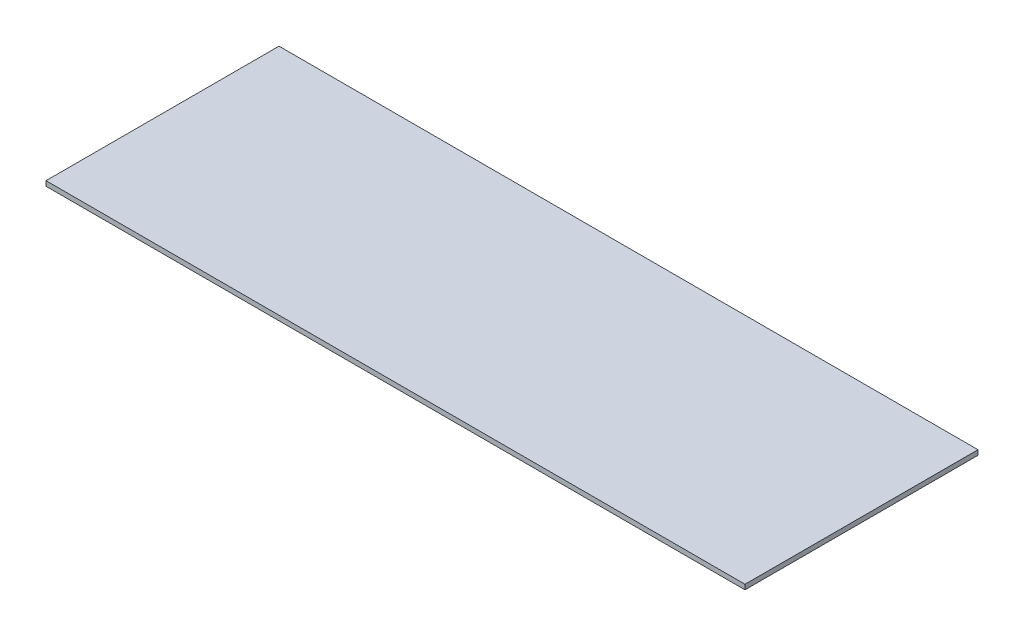
ISO-10303-21;
HEADER;
FILE_DESCRIPTION(('STEP AP214'),'2;1');
FILE_NAME('part.step','',(''),(''),'','','');
FILE_SCHEMA(('AUTOMOTIVE_DESIGN { 1 0 10303 214 1 1 1 1 }'));
ENDSEC;
DATA;
#1=APPLICATION_CONTEXT('core data for automotive mechanical design processes');
#2=APPLICATION_PROTOCOL_DEFINITION('international standard','automotive_design',2000,#1);
#3=PRODUCT_CONTEXT('',#1,'mechanical');
#4=PRODUCT('Part','Part','',(#3));
#5=PRODUCT_RELATED_PRODUCT_CATEGORY('part','',(#4));
#6=PRODUCT_DEFINITION_FORMATION('','',#4);
#7=PRODUCT_DEFINITION_CONTEXT('part definition',#1,'design');
#8=PRODUCT_DEFINITION('design','',#6,#7);
#9=PRODUCT_DEFINITION_SHAPE('','',#8);
#10=(LENGTH_UNIT() NAMED_UNIT(*) SI_UNIT(.MILLI.,.METRE.));
#11=(NAMED_UNIT(*) PLANE_ANGLE_UNIT() SI_UNIT($,.RADIAN.));
#12=(NAMED_UNIT(*) SI_UNIT($,.STERADIAN.) SOLID_ANGLE_UNIT());
#13=UNCERTAINTY_MEASURE_WITH_UNIT(LENGTH_MEASURE(1.E-05),#10,'distance_accuracy_value','');
#14=(GEOMETRIC_REPRESENTATION_CONTEXT(3) GLOBAL_UNCERTAINTY_ASSIGNED_CONTEXT((#13)) GLOBAL_UNIT_ASSIGNED_CONTEXT((#10,
#11,#12)) REPRESENTATION_CONTEXT('',''));
#15=CARTESIAN_POINT('',(0.,0.,0.));
#16=DIRECTION('',(0.,0.,1.));
#17=DIRECTION('',(1.,0.,0.));
#18=AXIS2_PLACEMENT_3D('',#15,#16,#17);
#19=CARTESIAN_POINT('',(0.,3.175,0.));
#20=DIRECTION('',(1.,0.,0.));
#21=DIRECTION('',(0.,0.,-1.));
#22=AXIS2_PLACEMENT_3D('',#19,#20,#21);
#23=PLANE('',#22);
#24=DIRECTION('',(0.,0.,1.));
#25=VECTOR('',#24,1.);
#26=CARTESIAN_POINT('',(0.,0.,0.));
#27=LINE('',#26,#25);
#28=CARTESIAN_POINT('',(0.,0.,-152.4));
#29=VERTEX_POINT('',#28);
#30=CARTESIAN_POINT('',(0.,0.,0.));
#31=VERTEX_POINT('',#30);
#32=EDGE_CURVE('E96',#29,#31,#27,.T.);
#33=ORIENTED_EDGE('',*,*,#32,.T.);
#34=DIRECTION('',(0.,-1.,0.));
#35=VECTOR('',#34,1.);
#36=CARTESIAN_POINT('',(0.,3.175,0.));
#37=LINE('',#36,#35);
#38=CARTESIAN_POINT('',(0.,3.175,0.));
#39=VERTEX_POINT('',#38);
#40=EDGE_CURVE('E11',#39,#31,#37,.T.);
#41=ORIENTED_EDGE('',*,*,#40,.F.);
#42=DIRECTION('',(0.,0.,1.));
#43=VECTOR('',#42,1.);
#44=CARTESIAN_POINT('',(0.,3.175,0.));
#45=LINE('',#44,#43);
#46=CARTESIAN_POINT('',(0.,3.175,-152.4));
#47=VERTEX_POINT('',#46);
#48=EDGE_CURVE('E84',#47,#39,#45,.T.);
#49=ORIENTED_EDGE('',*,*,#48,.F.);
#50=DIRECTION('',(0.,-1.,0.));
#51=VECTOR('',#50,1.);
#52=CARTESIAN_POINT('',(0.,3.175,-152.4));
#53=LINE('',#52,#51);
#54=EDGE_CURVE('E92',#47,#29,#53,.T.);
#55=ORIENTED_EDGE('',*,*,#54,.T.);
#56=EDGE_LOOP('',(#33,#41,#49,#55));
#57=FACE_BOUND('',#56,.T.);
#58=ADVANCED_FACE('F33',(#57),#23,.F.);
#59=CARTESIAN_POINT('',(0.,3.175,0.));
#60=DIRECTION('',(0.,0.,-1.));
#61=DIRECTION('',(-1.,0.,0.));
#62=AXIS2_PLACEMENT_3D('',#59,#60,#61);
#63=PLANE('',#62);
#64=DIRECTION('',(1.,0.,0.));
#65=VECTOR('',#64,1.);
#66=CARTESIAN_POINT('',(0.,0.,0.));
#67=LINE('',#66,#65);
#68=CARTESIAN_POINT('',(457.2,0.,0.));
#69=VERTEX_POINT('',#68);
#70=EDGE_CURVE('E88',#31,#69,#67,.T.);
#71=ORIENTED_EDGE('',*,*,#70,.T.);
#72=DIRECTION('',(0.,-1.,0.));
#73=VECTOR('',#72,1.);
#74=CARTESIAN_POINT('',(457.2,3.175,0.));
#75=LINE('',#74,#73);
#76=CARTESIAN_POINT('',(457.2,3.175,0.));
#77=VERTEX_POINT('',#76);
#78=EDGE_CURVE('E41',#77,#69,#75,.T.);
#79=ORIENTED_EDGE('',*,*,#78,.F.);
#80=DIRECTION('',(1.,0.,0.));
#81=VECTOR('',#80,1.);
#82=CARTESIAN_POINT('',(0.,3.175,0.));
#83=LINE('',#82,#81);
#84=EDGE_CURVE('E79',#39,#77,#83,.T.);
#85=ORIENTED_EDGE('',*,*,#84,.F.);
#86=ORIENTED_EDGE('',*,*,#40,.T.);
#87=EDGE_LOOP('',(#71,#79,#85,#86));
#88=FACE_BOUND('',#87,.T.);
#89=ADVANCED_FACE('F87',(#88),#63,.F.);
#90=CARTESIAN_POINT('',(457.2,3.175,0.));
#91=DIRECTION('',(-1.,0.,0.));
#92=DIRECTION('',(0.,0.,1.));
#93=AXIS2_PLACEMENT_3D('',#90,#91,#92);
#94=PLANE('',#93);
#95=DIRECTION('',(0.,0.,-1.));
#96=VECTOR('',#95,1.);
#97=CARTESIAN_POINT('',(457.2,0.,0.));
#98=LINE('',#97,#96);
#99=CARTESIAN_POINT('',(457.2,0.,-152.4));
#100=VERTEX_POINT('',#99);
#101=EDGE_CURVE('E66',#69,#100,#98,.T.);
#102=ORIENTED_EDGE('',*,*,#101,.T.);
#103=DIRECTION('',(0.,-1.,0.));
#104=VECTOR('',#103,1.);
#105=CARTESIAN_POINT('',(457.2,3.175,-152.4));
#106=LINE('',#105,#104);
#107=CARTESIAN_POINT('',(457.2,3.175,-152.4));
#108=VERTEX_POINT('',#107);
#109=EDGE_CURVE('E89',#108,#100,#106,.T.);
#110=ORIENTED_EDGE('',*,*,#109,.F.);
#111=DIRECTION('',(0.,0.,-1.));
#112=VECTOR('',#111,1.);
#113=CARTESIAN_POINT('',(457.2,3.175,0.));
#114=LINE('',#113,#112);
#115=EDGE_CURVE('E82',#77,#108,#114,.T.);
#116=ORIENTED_EDGE('',*,*,#115,.F.);
#117=ORIENTED_EDGE('',*,*,#78,.T.);
#118=EDGE_LOOP('',(#102,#110,#116,#117));
#119=FACE_BOUND('',#118,.T.);
#120=ADVANCED_FACE('F90',(#119),#94,.F.);
#121=CARTESIAN_POINT('',(0.,3.175,-152.4));
#122=DIRECTION('',(0.,0.,1.));
#123=DIRECTION('',(1.,0.,0.));
#124=AXIS2_PLACEMENT_3D('',#121,#122,#123);
#125=PLANE('',#124);
#126=DIRECTION('',(-1.,0.,0.));
#127=VECTOR('',#126,1.);
#128=CARTESIAN_POINT('',(0.,0.,-152.4));
#129=LINE('',#128,#127);
#130=EDGE_CURVE('E72',#100,#29,#129,.T.);
#131=ORIENTED_EDGE('',*,*,#130,.T.);
#132=ORIENTED_EDGE('',*,*,#54,.F.);
#133=DIRECTION('',(-1.,0.,0.));
#134=VECTOR('',#133,1.);
#135=CARTESIAN_POINT('',(0.,3.175,-152.4));
#136=LINE('',#135,#134);
#137=EDGE_CURVE('E49',#108,#47,#136,.T.);
#138=ORIENTED_EDGE('',*,*,#137,.F.);
#139=ORIENTED_EDGE('',*,*,#109,.T.);
#140=EDGE_LOOP('',(#131,#132,#138,#139));
#141=FACE_BOUND('',#140,.T.);
#142=ADVANCED_FACE('F103',(#141),#125,.F.);
#143=CARTESIAN_POINT('',(0.,3.175,0.));
#144=DIRECTION('',(0.,-1.,0.));
#145=DIRECTION('',(0.,0.,-1.));
#146=AXIS2_PLACEMENT_3D('',#143,#144,#145);
#147=PLANE('',#146);
#148=ORIENTED_EDGE('',*,*,#48,.T.);
#149=ORIENTED_EDGE('',*,*,#84,.T.);
#150=ORIENTED_EDGE('',*,*,#115,.T.);
#151=ORIENTED_EDGE('',*,*,#137,.T.);
#152=EDGE_LOOP('',(#148,#149,#150,#151));
#153=FACE_BOUND('',#152,.T.);
#154=ADVANCED_FACE('F80',(#153),#147,.F.);
#155=CARTESIAN_POINT('',(0.,0.,0.));
#156=DIRECTION('',(0.,-1.,0.));
#157=DIRECTION('',(0.,0.,-1.));
#158=AXIS2_PLACEMENT_3D('',#155,#156,#157);
#159=PLANE('',#158);
#160=ORIENTED_EDGE('',*,*,#32,.F.);
#161=ORIENTED_EDGE('',*,*,#130,.F.);
#162=ORIENTED_EDGE('',*,*,#101,.F.);
#163=ORIENTED_EDGE('',*,*,#70,.F.);
#164=EDGE_LOOP('',(#160,#161,#162,#163));
#165=FACE_BOUND('',#164,.T.);
#166=ADVANCED_FACE('F106',(#165),#159,.T.);
#167=CLOSED_SHELL('',(#58,#89,#120,#142,#154,#166));
#168=MANIFOLD_SOLID_BREP('B2',#167);
#169=ADVANCED_BREP_SHAPE_REPRESENTATION('',(#18,#168),#14);
#170=SHAPE_DEFINITION_REPRESENTATION(#9,#169);
ENDSEC;
END-ISO-10303-21;
